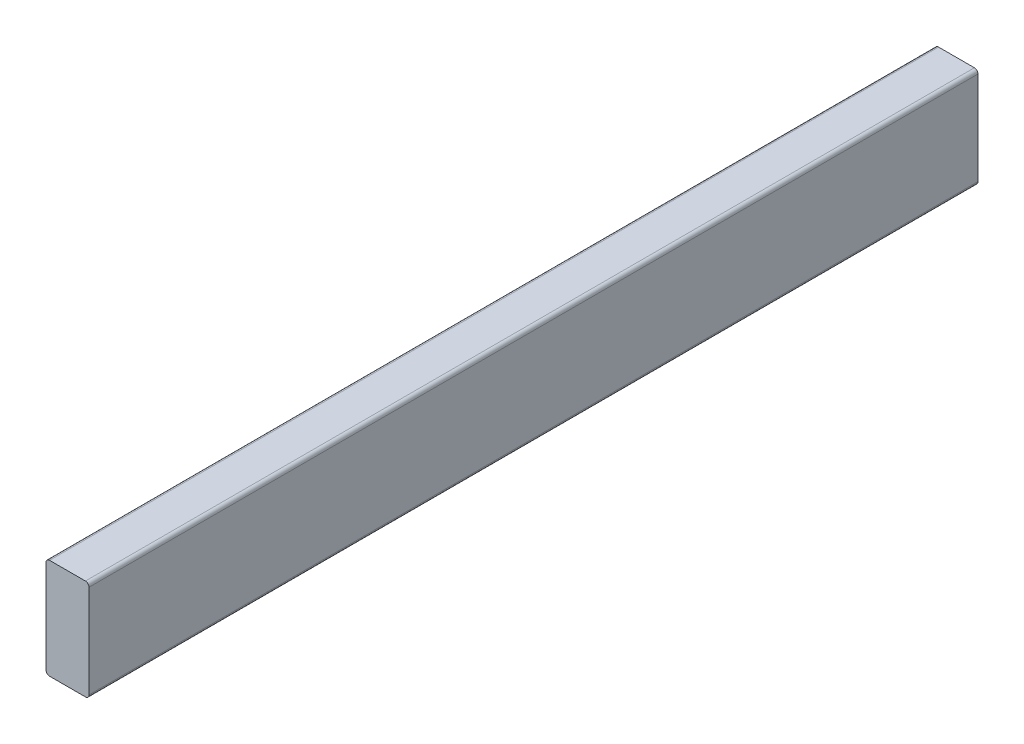
ISO-10303-21;
HEADER;
FILE_DESCRIPTION(('STEP AP214'),'2;1');
FILE_NAME('part.step','',(''),(''),'','','');
FILE_SCHEMA(('AUTOMOTIVE_DESIGN { 1 0 10303 214 1 1 1 1 }'));
ENDSEC;
DATA;
#1=APPLICATION_CONTEXT('core data for automotive mechanical design processes');
#2=APPLICATION_PROTOCOL_DEFINITION('international standard','automotive_design',2000,#1);
#3=PRODUCT_CONTEXT('',#1,'mechanical');
#4=PRODUCT('Part','Part','',(#3));
#5=PRODUCT_RELATED_PRODUCT_CATEGORY('part','',(#4));
#6=PRODUCT_DEFINITION_FORMATION('','',#4);
#7=PRODUCT_DEFINITION_CONTEXT('part definition',#1,'design');
#8=PRODUCT_DEFINITION('design','',#6,#7);
#9=PRODUCT_DEFINITION_SHAPE('','',#8);
#10=(LENGTH_UNIT() NAMED_UNIT(*) SI_UNIT(.MILLI.,.METRE.));
#11=(NAMED_UNIT(*) PLANE_ANGLE_UNIT() SI_UNIT($,.RADIAN.));
#12=(NAMED_UNIT(*) SI_UNIT($,.STERADIAN.) SOLID_ANGLE_UNIT());
#13=UNCERTAINTY_MEASURE_WITH_UNIT(LENGTH_MEASURE(1.E-05),#10,'distance_accuracy_value','');
#14=(GEOMETRIC_REPRESENTATION_CONTEXT(3) GLOBAL_UNCERTAINTY_ASSIGNED_CONTEXT((#13)) GLOBAL_UNIT_ASSIGNED_CONTEXT((#10,
#11,#12)) REPRESENTATION_CONTEXT('',''));
#15=CARTESIAN_POINT('',(0.,0.,0.));
#16=DIRECTION('',(0.,0.,1.));
#17=DIRECTION('',(1.,0.,0.));
#18=AXIS2_PLACEMENT_3D('',#15,#16,#17);
#19=CARTESIAN_POINT('',(0.,0.,-393.7));
#20=DIRECTION('',(-1.,0.,0.));
#21=DIRECTION('',(0.,0.,1.));
#22=AXIS2_PLACEMENT_3D('',#19,#20,#21);
#23=PLANE('',#22);
#24=DIRECTION('',(0.,-1.,0.));
#25=VECTOR('',#24,1.);
#26=CARTESIAN_POINT('',(0.,0.,-393.7));
#27=LINE('',#26,#25);
#28=CARTESIAN_POINT('',(0.,85.725,-393.7));
#29=VERTEX_POINT('',#28);
#30=CARTESIAN_POINT('',(0.,3.17499999999998,-393.7));
#31=VERTEX_POINT('',#30);
#32=EDGE_CURVE('E163',#29,#31,#27,.T.);
#33=ORIENTED_EDGE('',*,*,#32,.T.);
#34=DIRECTION('',(0.,0.,1.));
#35=VECTOR('',#34,1.);
#36=CARTESIAN_POINT('',(0.,3.17499999999998,-393.7));
#37=LINE('',#36,#35);
#38=CARTESIAN_POINT('',(0.,3.17499999999998,393.7));
#39=VERTEX_POINT('',#38);
#40=EDGE_CURVE('E119',#31,#39,#37,.T.);
#41=ORIENTED_EDGE('',*,*,#40,.T.);
#42=DIRECTION('',(0.,-1.,0.));
#43=VECTOR('',#42,1.);
#44=CARTESIAN_POINT('',(0.,0.,393.7));
#45=LINE('',#44,#43);
#46=CARTESIAN_POINT('',(0.,85.725,393.7));
#47=VERTEX_POINT('',#46);
#48=EDGE_CURVE('E104',#47,#39,#45,.T.);
#49=ORIENTED_EDGE('',*,*,#48,.F.);
#50=DIRECTION('',(0.,0.,1.));
#51=VECTOR('',#50,1.);
#52=CARTESIAN_POINT('',(0.,85.725,-393.7));
#53=LINE('',#52,#51);
#54=EDGE_CURVE('E116',#47,#29,#53,.F.);
#55=ORIENTED_EDGE('',*,*,#54,.T.);
#56=EDGE_LOOP('',(#33,#41,#49,#55));
#57=FACE_BOUND('',#56,.T.);
#58=ADVANCED_FACE('F34',(#57),#23,.T.);
#59=CARTESIAN_POINT('',(0.,88.9,-393.7));
#60=DIRECTION('',(0.,1.,0.));
#61=DIRECTION('',(0.,0.,1.));
#62=AXIS2_PLACEMENT_3D('',#59,#60,#61);
#63=PLANE('',#62);
#64=DIRECTION('',(-1.,0.,0.));
#65=VECTOR('',#64,1.);
#66=CARTESIAN_POINT('',(0.,88.9,-393.7));
#67=LINE('',#66,#65);
#68=CARTESIAN_POINT('',(34.925,88.9,-393.7));
#69=VERTEX_POINT('',#68);
#70=CARTESIAN_POINT('',(3.17500000000004,88.9,-393.7));
#71=VERTEX_POINT('',#70);
#72=EDGE_CURVE('E125',#69,#71,#67,.T.);
#73=ORIENTED_EDGE('',*,*,#72,.T.);
#74=DIRECTION('',(0.,0.,1.));
#75=VECTOR('',#74,1.);
#76=CARTESIAN_POINT('',(3.17500000000004,88.9,-393.7));
#77=LINE('',#76,#75);
#78=CARTESIAN_POINT('',(3.17500000000004,88.9,393.7));
#79=VERTEX_POINT('',#78);
#80=EDGE_CURVE('E11',#71,#79,#77,.T.);
#81=ORIENTED_EDGE('',*,*,#80,.T.);
#82=DIRECTION('',(-1.,0.,0.));
#83=VECTOR('',#82,1.);
#84=CARTESIAN_POINT('',(0.,88.9,393.7));
#85=LINE('',#84,#83);
#86=CARTESIAN_POINT('',(34.925,88.9,393.7));
#87=VERTEX_POINT('',#86);
#88=EDGE_CURVE('E106',#87,#79,#85,.T.);
#89=ORIENTED_EDGE('',*,*,#88,.F.);
#90=DIRECTION('',(0.,0.,1.));
#91=VECTOR('',#90,1.);
#92=CARTESIAN_POINT('',(34.925,88.9,-393.7));
#93=LINE('',#92,#91);
#94=EDGE_CURVE('E42',#87,#69,#93,.F.);
#95=ORIENTED_EDGE('',*,*,#94,.T.);
#96=EDGE_LOOP('',(#73,#81,#89,#95));
#97=FACE_BOUND('',#96,.T.);
#98=ADVANCED_FACE('F154',(#97),#63,.T.);
#99=CARTESIAN_POINT('',(38.1,0.,-393.7));
#100=DIRECTION('',(1.,0.,0.));
#101=DIRECTION('',(0.,0.,-1.));
#102=AXIS2_PLACEMENT_3D('',#99,#100,#101);
#103=PLANE('',#102);
#104=DIRECTION('',(0.,1.,0.));
#105=VECTOR('',#104,1.);
#106=CARTESIAN_POINT('',(38.1,0.,393.7));
#107=LINE('',#106,#105);
#108=CARTESIAN_POINT('',(38.1,3.17499999999998,393.7));
#109=VERTEX_POINT('',#108);
#110=CARTESIAN_POINT('',(38.1,85.725,393.7));
#111=VERTEX_POINT('',#110);
#112=EDGE_CURVE('E161',#109,#111,#107,.T.);
#113=ORIENTED_EDGE('',*,*,#112,.F.);
#114=DIRECTION('',(0.,0.,1.));
#115=VECTOR('',#114,1.);
#116=CARTESIAN_POINT('',(38.1,3.17499999999998,-393.7));
#117=LINE('',#116,#115);
#118=CARTESIAN_POINT('',(38.1,3.17499999999998,-393.7));
#119=VERTEX_POINT('',#118);
#120=EDGE_CURVE('E56',#109,#119,#117,.F.);
#121=ORIENTED_EDGE('',*,*,#120,.T.);
#122=DIRECTION('',(0.,1.,0.));
#123=VECTOR('',#122,1.);
#124=CARTESIAN_POINT('',(38.1,0.,-393.7));
#125=LINE('',#124,#123);
#126=CARTESIAN_POINT('',(38.1,85.725,-393.7));
#127=VERTEX_POINT('',#126);
#128=EDGE_CURVE('E129',#119,#127,#125,.T.);
#129=ORIENTED_EDGE('',*,*,#128,.T.);
#130=DIRECTION('',(0.,0.,1.));
#131=VECTOR('',#130,1.);
#132=CARTESIAN_POINT('',(38.1,85.725,-393.7));
#133=LINE('',#132,#131);
#134=EDGE_CURVE('E149',#127,#111,#133,.T.);
#135=ORIENTED_EDGE('',*,*,#134,.T.);
#136=EDGE_LOOP('',(#113,#121,#129,#135));
#137=FACE_BOUND('',#136,.T.);
#138=ADVANCED_FACE('F160',(#137),#103,.T.);
#139=CARTESIAN_POINT('',(0.,0.,-393.7));
#140=DIRECTION('',(0.,-1.,0.));
#141=DIRECTION('',(0.,0.,-1.));
#142=AXIS2_PLACEMENT_3D('',#139,#140,#141);
#143=PLANE('',#142);
#144=DIRECTION('',(1.,0.,0.));
#145=VECTOR('',#144,1.);
#146=CARTESIAN_POINT('',(0.,0.,393.7));
#147=LINE('',#146,#145);
#148=CARTESIAN_POINT('',(3.17500000000004,0.,393.7));
#149=VERTEX_POINT('',#148);
#150=CARTESIAN_POINT('',(34.925,0.,393.7));
#151=VERTEX_POINT('',#150);
#152=EDGE_CURVE('E120',#149,#151,#147,.T.);
#153=ORIENTED_EDGE('',*,*,#152,.F.);
#154=DIRECTION('',(0.,0.,1.));
#155=VECTOR('',#154,1.);
#156=CARTESIAN_POINT('',(3.17500000000004,0.,-393.7));
#157=LINE('',#156,#155);
#158=CARTESIAN_POINT('',(3.17500000000004,0.,-393.7));
#159=VERTEX_POINT('',#158);
#160=EDGE_CURVE('E141',#149,#159,#157,.F.);
#161=ORIENTED_EDGE('',*,*,#160,.T.);
#162=DIRECTION('',(1.,0.,0.));
#163=VECTOR('',#162,1.);
#164=CARTESIAN_POINT('',(0.,0.,-393.7));
#165=LINE('',#164,#163);
#166=CARTESIAN_POINT('',(34.925,0.,-393.7));
#167=VERTEX_POINT('',#166);
#168=EDGE_CURVE('E167',#159,#167,#165,.T.);
#169=ORIENTED_EDGE('',*,*,#168,.T.);
#170=DIRECTION('',(0.,0.,1.));
#171=VECTOR('',#170,1.);
#172=CARTESIAN_POINT('',(34.925,0.,-393.7));
#173=LINE('',#172,#171);
#174=EDGE_CURVE('E138',#167,#151,#173,.T.);
#175=ORIENTED_EDGE('',*,*,#174,.T.);
#176=EDGE_LOOP('',(#153,#161,#169,#175));
#177=FACE_BOUND('',#176,.T.);
#178=ADVANCED_FACE('F176',(#177),#143,.T.);
#179=CARTESIAN_POINT('',(0.,0.,-393.7));
#180=DIRECTION('',(0.,0.,-1.));
#181=DIRECTION('',(-1.,0.,0.));
#182=AXIS2_PLACEMENT_3D('',#179,#180,#181);
#183=PLANE('',#182);
#184=ORIENTED_EDGE('',*,*,#168,.F.);
#185=CARTESIAN_POINT('',(3.17500000000004,3.17499999999998,-393.7));
#186=DIRECTION('',(0.,0.,-1.));
#187=DIRECTION('',(-1.,0.,0.));
#188=AXIS2_PLACEMENT_3D('',#185,#186,#187);
#189=CIRCLE('',#188,3.175);
#190=EDGE_CURVE('E147',#159,#31,#189,.T.);
#191=ORIENTED_EDGE('',*,*,#190,.T.);
#192=ORIENTED_EDGE('',*,*,#32,.F.);
#193=CARTESIAN_POINT('',(3.17500000000004,85.725,-393.7));
#194=DIRECTION('',(0.,0.,-1.));
#195=DIRECTION('',(-1.,0.,0.));
#196=AXIS2_PLACEMENT_3D('',#193,#194,#195);
#197=CIRCLE('',#196,3.175);
#198=EDGE_CURVE('E124',#29,#71,#197,.T.);
#199=ORIENTED_EDGE('',*,*,#198,.T.);
#200=ORIENTED_EDGE('',*,*,#72,.F.);
#201=CARTESIAN_POINT('',(34.925,85.725,-393.7));
#202=DIRECTION('',(0.,0.,-1.));
#203=DIRECTION('',(-1.,0.,0.));
#204=AXIS2_PLACEMENT_3D('',#201,#202,#203);
#205=CIRCLE('',#204,3.175);
#206=EDGE_CURVE('E49',#69,#127,#205,.T.);
#207=ORIENTED_EDGE('',*,*,#206,.T.);
#208=ORIENTED_EDGE('',*,*,#128,.F.);
#209=CARTESIAN_POINT('',(34.925,3.17499999999998,-393.7));
#210=DIRECTION('',(0.,0.,-1.));
#211=DIRECTION('',(-1.,0.,0.));
#212=AXIS2_PLACEMENT_3D('',#209,#210,#211);
#213=CIRCLE('',#212,3.175);
#214=EDGE_CURVE('E145',#119,#167,#213,.T.);
#215=ORIENTED_EDGE('',*,*,#214,.T.);
#216=EDGE_LOOP('',(#184,#191,#192,#199,#200,#207,#208,#215));
#217=FACE_BOUND('',#216,.T.);
#218=ADVANCED_FACE('F157',(#217),#183,.T.);
#219=CARTESIAN_POINT('',(0.,0.,393.7));
#220=DIRECTION('',(0.,0.,-1.));
#221=DIRECTION('',(-1.,0.,0.));
#222=AXIS2_PLACEMENT_3D('',#219,#220,#221);
#223=PLANE('',#222);
#224=ORIENTED_EDGE('',*,*,#48,.T.);
#225=CARTESIAN_POINT('',(3.17500000000004,3.17499999999998,393.7));
#226=DIRECTION('',(0.,0.,-1.));
#227=DIRECTION('',(-1.,0.,0.));
#228=AXIS2_PLACEMENT_3D('',#225,#226,#227);
#229=CIRCLE('',#228,3.175);
#230=EDGE_CURVE('E136',#39,#149,#229,.F.);
#231=ORIENTED_EDGE('',*,*,#230,.T.);
#232=ORIENTED_EDGE('',*,*,#152,.T.);
#233=CARTESIAN_POINT('',(34.925,3.17499999999998,393.7));
#234=DIRECTION('',(0.,0.,-1.));
#235=DIRECTION('',(-1.,0.,0.));
#236=AXIS2_PLACEMENT_3D('',#233,#234,#235);
#237=CIRCLE('',#236,3.175);
#238=EDGE_CURVE('E110',#151,#109,#237,.F.);
#239=ORIENTED_EDGE('',*,*,#238,.T.);
#240=ORIENTED_EDGE('',*,*,#112,.T.);
#241=CARTESIAN_POINT('',(34.925,85.725,393.7));
#242=DIRECTION('',(0.,0.,-1.));
#243=DIRECTION('',(-1.,0.,0.));
#244=AXIS2_PLACEMENT_3D('',#241,#242,#243);
#245=CIRCLE('',#244,3.175);
#246=EDGE_CURVE('E111',#111,#87,#245,.F.);
#247=ORIENTED_EDGE('',*,*,#246,.T.);
#248=ORIENTED_EDGE('',*,*,#88,.T.);
#249=CARTESIAN_POINT('',(3.17500000000004,85.725,393.7));
#250=DIRECTION('',(0.,0.,-1.));
#251=DIRECTION('',(-1.,0.,0.));
#252=AXIS2_PLACEMENT_3D('',#249,#250,#251);
#253=CIRCLE('',#252,3.175);
#254=EDGE_CURVE('E101',#79,#47,#253,.F.);
#255=ORIENTED_EDGE('',*,*,#254,.T.);
#256=EDGE_LOOP('',(#224,#231,#232,#239,#240,#247,#248,#255));
#257=FACE_BOUND('',#256,.T.);
#258=ADVANCED_FACE('F103',(#257),#223,.F.);
#259=CARTESIAN_POINT('',(3.17500000000004,3.17499999999998,-393.7));
#260=DIRECTION('',(0.,0.,1.));
#261=DIRECTION('',(1.,0.,0.));
#262=AXIS2_PLACEMENT_3D('',#259,#260,#261);
#263=CYLINDRICAL_SURFACE('',#262,3.175);
#264=ORIENTED_EDGE('',*,*,#190,.F.);
#265=ORIENTED_EDGE('',*,*,#160,.F.);
#266=ORIENTED_EDGE('',*,*,#230,.F.);
#267=ORIENTED_EDGE('',*,*,#40,.F.);
#268=EDGE_LOOP('',(#264,#265,#266,#267));
#269=FACE_BOUND('',#268,.T.);
#270=ADVANCED_FACE('F172',(#269),#263,.T.);
#271=CARTESIAN_POINT('',(34.925,3.17499999999998,-393.7));
#272=DIRECTION('',(0.,0.,1.));
#273=DIRECTION('',(1.,0.,0.));
#274=AXIS2_PLACEMENT_3D('',#271,#272,#273);
#275=CYLINDRICAL_SURFACE('',#274,3.175);
#276=ORIENTED_EDGE('',*,*,#214,.F.);
#277=ORIENTED_EDGE('',*,*,#120,.F.);
#278=ORIENTED_EDGE('',*,*,#238,.F.);
#279=ORIENTED_EDGE('',*,*,#174,.F.);
#280=EDGE_LOOP('',(#276,#277,#278,#279));
#281=FACE_BOUND('',#280,.T.);
#282=ADVANCED_FACE('F180',(#281),#275,.T.);
#283=CARTESIAN_POINT('',(3.17500000000004,85.725,-393.7));
#284=DIRECTION('',(0.,0.,1.));
#285=DIRECTION('',(1.,0.,0.));
#286=AXIS2_PLACEMENT_3D('',#283,#284,#285);
#287=CYLINDRICAL_SURFACE('',#286,3.175);
#288=ORIENTED_EDGE('',*,*,#198,.F.);
#289=ORIENTED_EDGE('',*,*,#54,.F.);
#290=ORIENTED_EDGE('',*,*,#254,.F.);
#291=ORIENTED_EDGE('',*,*,#80,.F.);
#292=EDGE_LOOP('',(#288,#289,#290,#291));
#293=FACE_BOUND('',#292,.T.);
#294=ADVANCED_FACE('F123',(#293),#287,.T.);
#295=CARTESIAN_POINT('',(34.925,85.725,-393.7));
#296=DIRECTION('',(0.,0.,1.));
#297=DIRECTION('',(1.,0.,0.));
#298=AXIS2_PLACEMENT_3D('',#295,#296,#297);
#299=CYLINDRICAL_SURFACE('',#298,3.175);
#300=ORIENTED_EDGE('',*,*,#206,.F.);
#301=ORIENTED_EDGE('',*,*,#94,.F.);
#302=ORIENTED_EDGE('',*,*,#246,.F.);
#303=ORIENTED_EDGE('',*,*,#134,.F.);
#304=EDGE_LOOP('',(#300,#301,#302,#303));
#305=FACE_BOUND('',#304,.T.);
#306=ADVANCED_FACE('F36',(#305),#299,.T.);
#307=CLOSED_SHELL('',(#58,#98,#138,#178,#218,#258,#270,#282,#294,#306));
#308=MANIFOLD_SOLID_BREP('B2',#307);
#309=ADVANCED_BREP_SHAPE_REPRESENTATION('',(#18,#308),#14);
#310=SHAPE_DEFINITION_REPRESENTATION(#9,#309);
ENDSEC;
END-ISO-10303-21;
